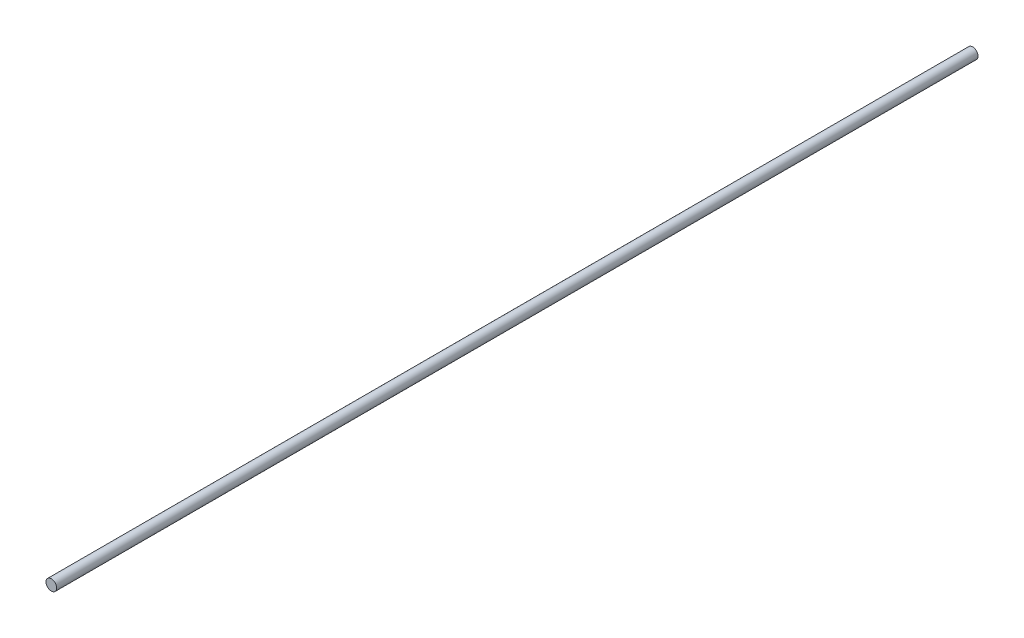
ISO-10303-21;
HEADER;
FILE_DESCRIPTION(('STEP AP214'),'2;1');
FILE_NAME('part.step','',(''),(''),'','','');
FILE_SCHEMA(('AUTOMOTIVE_DESIGN { 1 0 10303 214 1 1 1 1 }'));
ENDSEC;
DATA;
#1=APPLICATION_CONTEXT('core data for automotive mechanical design processes');
#2=APPLICATION_PROTOCOL_DEFINITION('international standard','automotive_design',2000,#1);
#3=PRODUCT_CONTEXT('',#1,'mechanical');
#4=PRODUCT('Part','Part','',(#3));
#5=PRODUCT_RELATED_PRODUCT_CATEGORY('part','',(#4));
#6=PRODUCT_DEFINITION_FORMATION('','',#4);
#7=PRODUCT_DEFINITION_CONTEXT('part definition',#1,'design');
#8=PRODUCT_DEFINITION('design','',#6,#7);
#9=PRODUCT_DEFINITION_SHAPE('','',#8);
#10=(LENGTH_UNIT() NAMED_UNIT(*) SI_UNIT(.MILLI.,.METRE.));
#11=(NAMED_UNIT(*) PLANE_ANGLE_UNIT() SI_UNIT($,.RADIAN.));
#12=(NAMED_UNIT(*) SI_UNIT($,.STERADIAN.) SOLID_ANGLE_UNIT());
#13=UNCERTAINTY_MEASURE_WITH_UNIT(LENGTH_MEASURE(1.E-05),#10,'distance_accuracy_value','');
#14=(GEOMETRIC_REPRESENTATION_CONTEXT(3) GLOBAL_UNCERTAINTY_ASSIGNED_CONTEXT((#13)) GLOBAL_UNIT_ASSIGNED_CONTEXT((#10,
#11,#12)) REPRESENTATION_CONTEXT('',''));
#15=CARTESIAN_POINT('',(0.,0.,0.));
#16=DIRECTION('',(0.,0.,1.));
#17=DIRECTION('',(1.,0.,0.));
#18=AXIS2_PLACEMENT_3D('',#15,#16,#17);
#19=CARTESIAN_POINT('',(0.,0.,547.));
#20=DIRECTION('',(0.,0.,-1.));
#21=DIRECTION('',(-1.,0.,0.));
#22=AXIS2_PLACEMENT_3D('',#19,#20,#21);
#23=CYLINDRICAL_SURFACE('',#22,3.175);
#24=CARTESIAN_POINT('',(0.,0.,547.));
#25=DIRECTION('',(0.,0.,1.));
#26=DIRECTION('',(1.,0.,0.));
#27=AXIS2_PLACEMENT_3D('',#24,#25,#26);
#28=CIRCLE('',#27,3.175);
#29=CARTESIAN_POINT('',(3.175,0.,547.));
#30=VERTEX_POINT('',#29);
#31=EDGE_CURVE('E10',#30,#30,#28,.T.);
#32=ORIENTED_EDGE('',*,*,#31,.F.);
#33=EDGE_LOOP('',(#32));
#34=FACE_BOUND('',#33,.T.);
#35=CARTESIAN_POINT('',(0.,0.,0.));
#36=DIRECTION('',(0.,0.,1.));
#37=DIRECTION('',(1.,0.,0.));
#38=AXIS2_PLACEMENT_3D('',#35,#36,#37);
#39=CIRCLE('',#38,3.175);
#40=CARTESIAN_POINT('',(3.175,0.,0.));
#41=VERTEX_POINT('',#40);
#42=EDGE_CURVE('E17',#41,#41,#39,.T.);
#43=ORIENTED_EDGE('',*,*,#42,.T.);
#44=EDGE_LOOP('',(#43));
#45=FACE_BOUND('',#44,.T.);
#46=ADVANCED_FACE('F14',(#34,#45),#23,.T.);
#47=CARTESIAN_POINT('',(0.,0.,547.));
#48=DIRECTION('',(0.,0.,1.));
#49=DIRECTION('',(1.,0.,0.));
#50=AXIS2_PLACEMENT_3D('',#47,#48,#49);
#51=PLANE('',#50);
#52=ORIENTED_EDGE('',*,*,#31,.T.);
#53=EDGE_LOOP('',(#52));
#54=FACE_BOUND('',#53,.T.);
#55=ADVANCED_FACE('F29',(#54),#51,.T.);
#56=CARTESIAN_POINT('',(0.,0.,0.));
#57=DIRECTION('',(0.,0.,1.));
#58=DIRECTION('',(1.,0.,0.));
#59=AXIS2_PLACEMENT_3D('',#56,#57,#58);
#60=PLANE('',#59);
#61=ORIENTED_EDGE('',*,*,#42,.F.);
#62=EDGE_LOOP('',(#61));
#63=FACE_BOUND('',#62,.T.);
#64=ADVANCED_FACE('F27',(#63),#60,.F.);
#65=CLOSED_SHELL('',(#46,#55,#64));
#66=MANIFOLD_SOLID_BREP('B1',#65);
#67=ADVANCED_BREP_SHAPE_REPRESENTATION('',(#18,#66),#14);
#68=SHAPE_DEFINITION_REPRESENTATION(#9,#67);
ENDSEC;
END-ISO-10303-21;
